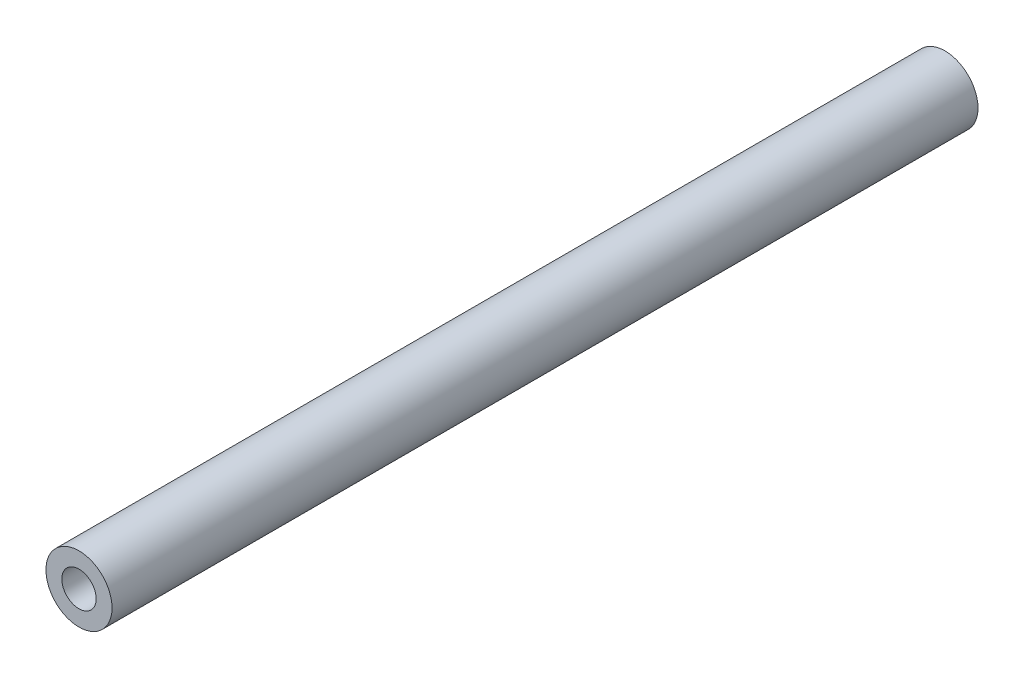
ISO-10303-21;
HEADER;
FILE_DESCRIPTION(('STEP AP214'),'2;1');
FILE_NAME('part.step','',(''),(''),'','','');
FILE_SCHEMA(('AUTOMOTIVE_DESIGN { 1 0 10303 214 1 1 1 1 }'));
ENDSEC;
DATA;
#1=APPLICATION_CONTEXT('core data for automotive mechanical design processes');
#2=APPLICATION_PROTOCOL_DEFINITION('international standard','automotive_design',2000,#1);
#3=PRODUCT_CONTEXT('',#1,'mechanical');
#4=PRODUCT('Part','Part','',(#3));
#5=PRODUCT_RELATED_PRODUCT_CATEGORY('part','',(#4));
#6=PRODUCT_DEFINITION_FORMATION('','',#4);
#7=PRODUCT_DEFINITION_CONTEXT('part definition',#1,'design');
#8=PRODUCT_DEFINITION('design','',#6,#7);
#9=PRODUCT_DEFINITION_SHAPE('','',#8);
#10=(LENGTH_UNIT() NAMED_UNIT(*) SI_UNIT(.MILLI.,.METRE.));
#11=(NAMED_UNIT(*) PLANE_ANGLE_UNIT() SI_UNIT($,.RADIAN.));
#12=(NAMED_UNIT(*) SI_UNIT($,.STERADIAN.) SOLID_ANGLE_UNIT());
#13=UNCERTAINTY_MEASURE_WITH_UNIT(LENGTH_MEASURE(1.E-05),#10,'distance_accuracy_value','');
#14=(GEOMETRIC_REPRESENTATION_CONTEXT(3) GLOBAL_UNCERTAINTY_ASSIGNED_CONTEXT((#13)) GLOBAL_UNIT_ASSIGNED_CONTEXT((#10,
#11,#12)) REPRESENTATION_CONTEXT('',''));
#15=CARTESIAN_POINT('',(0.,0.,0.));
#16=DIRECTION('',(0.,0.,1.));
#17=DIRECTION('',(1.,0.,0.));
#18=AXIS2_PLACEMENT_3D('',#15,#16,#17);
#19=CARTESIAN_POINT('',(0.,0.,65.5));
#20=DIRECTION('',(0.,0.,-1.));
#21=DIRECTION('',(-1.,0.,0.));
#22=AXIS2_PLACEMENT_3D('',#19,#20,#21);
#23=CYLINDRICAL_SURFACE('',#22,2.5);
#24=CARTESIAN_POINT('',(0.,0.,65.5));
#25=DIRECTION('',(0.,0.,1.));
#26=DIRECTION('',(1.,0.,0.));
#27=AXIS2_PLACEMENT_3D('',#24,#25,#26);
#28=CIRCLE('',#27,2.5);
#29=CARTESIAN_POINT('',(2.5,0.,65.5));
#30=VERTEX_POINT('',#29);
#31=EDGE_CURVE('E11',#30,#30,#28,.T.);
#32=ORIENTED_EDGE('',*,*,#31,.F.);
#33=EDGE_LOOP('',(#32));
#34=FACE_BOUND('',#33,.T.);
#35=CARTESIAN_POINT('',(0.,0.,0.));
#36=DIRECTION('',(0.,0.,1.));
#37=DIRECTION('',(1.,0.,0.));
#38=AXIS2_PLACEMENT_3D('',#35,#36,#37);
#39=CIRCLE('',#38,2.5);
#40=CARTESIAN_POINT('',(2.5,0.,0.));
#41=VERTEX_POINT('',#40);
#42=EDGE_CURVE('E52',#41,#41,#39,.T.);
#43=ORIENTED_EDGE('',*,*,#42,.T.);
#44=EDGE_LOOP('',(#43));
#45=FACE_BOUND('',#44,.T.);
#46=ADVANCED_FACE('F49',(#34,#45),#23,.T.);
#47=CARTESIAN_POINT('',(0.,0.,65.5));
#48=DIRECTION('',(0.,0.,1.));
#49=DIRECTION('',(1.,0.,0.));
#50=AXIS2_PLACEMENT_3D('',#47,#48,#49);
#51=PLANE('',#50);
#52=CARTESIAN_POINT('',(0.,0.,65.5));
#53=DIRECTION('',(0.,0.,1.));
#54=DIRECTION('',(1.,0.,0.));
#55=AXIS2_PLACEMENT_3D('',#52,#53,#54);
#56=CIRCLE('',#55,1.29999999999999);
#57=CARTESIAN_POINT('',(1.29999999999999,0.,65.5));
#58=VERTEX_POINT('',#57);
#59=EDGE_CURVE('E74',#58,#58,#56,.T.);
#60=ORIENTED_EDGE('',*,*,#59,.F.);
#61=EDGE_LOOP('',(#60));
#62=FACE_BOUND('',#61,.T.);
#63=ORIENTED_EDGE('',*,*,#31,.T.);
#64=EDGE_LOOP('',(#63));
#65=FACE_BOUND('',#64,.T.);
#66=ADVANCED_FACE('F97',(#62,#65),#51,.T.);
#67=CARTESIAN_POINT('',(0.,0.,0.));
#68=DIRECTION('',(0.,0.,1.));
#69=DIRECTION('',(1.,0.,0.));
#70=AXIS2_PLACEMENT_3D('',#67,#68,#69);
#71=PLANE('',#70);
#72=CARTESIAN_POINT('',(0.,0.,0.));
#73=DIRECTION('',(0.,0.,-1.));
#74=DIRECTION('',(-1.,0.,0.));
#75=AXIS2_PLACEMENT_3D('',#72,#73,#74);
#76=CIRCLE('',#75,1.29999999999999);
#77=CARTESIAN_POINT('',(-1.29999999999999,0.,0.));
#78=VERTEX_POINT('',#77);
#79=EDGE_CURVE('E75',#78,#78,#76,.T.);
#80=ORIENTED_EDGE('',*,*,#79,.F.);
#81=EDGE_LOOP('',(#80));
#82=FACE_BOUND('',#81,.T.);
#83=ORIENTED_EDGE('',*,*,#42,.F.);
#84=EDGE_LOOP('',(#83));
#85=FACE_BOUND('',#84,.T.);
#86=ADVANCED_FACE('F94',(#82,#85),#71,.F.);
#87=CARTESIAN_POINT('',(0.,0.,57.5));
#88=DIRECTION('',(0.,0.,1.));
#89=DIRECTION('',(1.,0.,0.));
#90=AXIS2_PLACEMENT_3D('',#87,#88,#89);
#91=CONICAL_SURFACE('',#90,1.29999999999999,1.02974425867665);
#92=CARTESIAN_POINT('',(0.,0.,56.7188811952642));
#93=VERTEX_POINT('',#92);
#94=VERTEX_LOOP('',#93);
#95=FACE_BOUND('',#94,.T.);
#96=CARTESIAN_POINT('',(0.,0.,57.5));
#97=DIRECTION('',(0.,0.,1.));
#98=DIRECTION('',(1.,0.,0.));
#99=AXIS2_PLACEMENT_3D('',#96,#97,#98);
#100=CIRCLE('',#99,1.29999999999999);
#101=CARTESIAN_POINT('',(1.29999999999999,0.,57.5));
#102=VERTEX_POINT('',#101);
#103=EDGE_CURVE('E80',#102,#102,#100,.T.);
#104=ORIENTED_EDGE('',*,*,#103,.T.);
#105=EDGE_LOOP('',(#104));
#106=FACE_BOUND('',#105,.T.);
#107=ADVANCED_FACE('F96',(#95,#106),#91,.F.);
#108=CARTESIAN_POINT('',(0.,0.,65.5));
#109=DIRECTION('',(0.,0.,1.));
#110=DIRECTION('',(1.,0.,0.));
#111=AXIS2_PLACEMENT_3D('',#108,#109,#110);
#112=CYLINDRICAL_SURFACE('',#111,1.29999999999999);
#113=ORIENTED_EDGE('',*,*,#103,.F.);
#114=EDGE_LOOP('',(#113));
#115=FACE_BOUND('',#114,.T.);
#116=ORIENTED_EDGE('',*,*,#59,.T.);
#117=EDGE_LOOP('',(#116));
#118=FACE_BOUND('',#117,.T.);
#119=ADVANCED_FACE('F67',(#115,#118),#112,.F.);
#120=CARTESIAN_POINT('',(0.,0.,7.99999999999999));
#121=DIRECTION('',(0.,0.,-1.));
#122=DIRECTION('',(-1.,0.,0.));
#123=AXIS2_PLACEMENT_3D('',#120,#121,#122);
#124=CONICAL_SURFACE('',#123,1.29999999999999,1.02974425867665);
#125=CARTESIAN_POINT('',(0.,0.,8.78111880473583));
#126=VERTEX_POINT('',#125);
#127=VERTEX_LOOP('',#126);
#128=FACE_BOUND('',#127,.T.);
#129=CARTESIAN_POINT('',(0.,0.,7.99999999999999));
#130=DIRECTION('',(0.,0.,-1.));
#131=DIRECTION('',(-1.,0.,0.));
#132=AXIS2_PLACEMENT_3D('',#129,#130,#131);
#133=CIRCLE('',#132,1.29999999999999);
#134=CARTESIAN_POINT('',(-1.29999999999999,0.,7.99999999999999));
#135=VERTEX_POINT('',#134);
#136=EDGE_CURVE('E71',#135,#135,#133,.T.);
#137=ORIENTED_EDGE('',*,*,#136,.T.);
#138=EDGE_LOOP('',(#137));
#139=FACE_BOUND('',#138,.T.);
#140=ADVANCED_FACE('F63',(#128,#139),#124,.F.);
#141=CARTESIAN_POINT('',(0.,0.,0.));
#142=DIRECTION('',(0.,0.,-1.));
#143=DIRECTION('',(-1.,0.,0.));
#144=AXIS2_PLACEMENT_3D('',#141,#142,#143);
#145=CYLINDRICAL_SURFACE('',#144,1.29999999999999);
#146=ORIENTED_EDGE('',*,*,#136,.F.);
#147=EDGE_LOOP('',(#146));
#148=FACE_BOUND('',#147,.T.);
#149=ORIENTED_EDGE('',*,*,#79,.T.);
#150=EDGE_LOOP('',(#149));
#151=FACE_BOUND('',#150,.T.);
#152=ADVANCED_FACE('F66',(#148,#151),#145,.F.);
#153=CLOSED_SHELL('',(#46,#66,#86,#107,#119,#140,#152));
#154=MANIFOLD_SOLID_BREP('B2',#153);
#155=ADVANCED_BREP_SHAPE_REPRESENTATION('',(#18,#154),#14);
#156=SHAPE_DEFINITION_REPRESENTATION(#9,#155);
ENDSEC;
END-ISO-10303-21;
